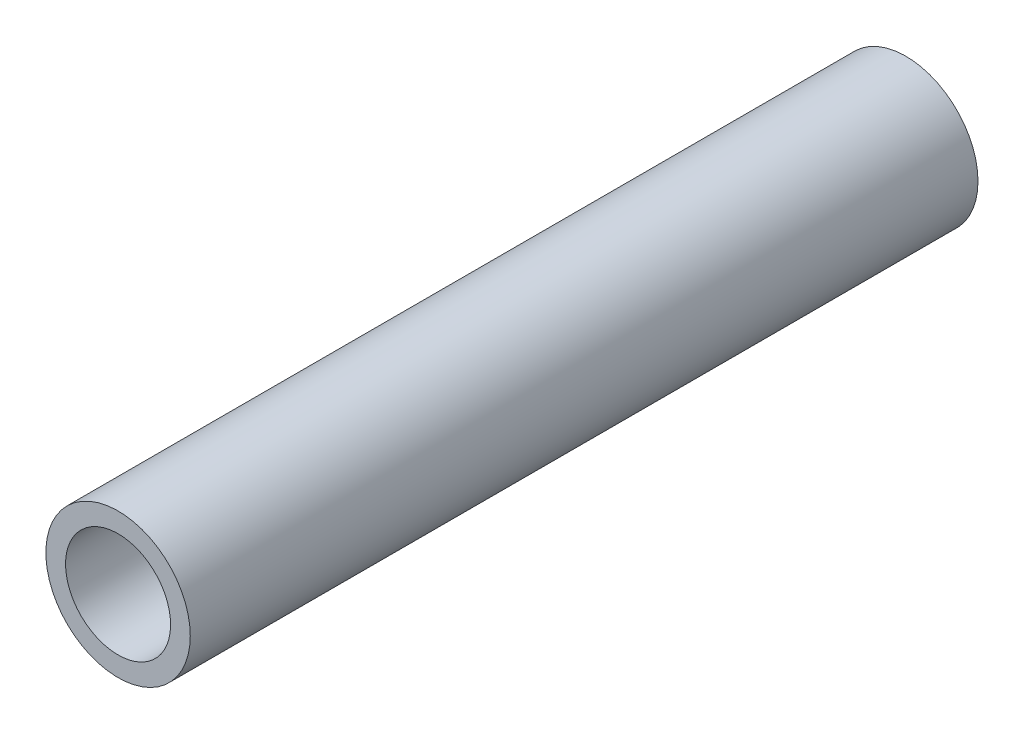
ISO-10303-21;
HEADER;
FILE_DESCRIPTION(('STEP AP214'),'2;1');
FILE_NAME('part.step','',(''),(''),'','','');
FILE_SCHEMA(('AUTOMOTIVE_DESIGN { 1 0 10303 214 1 1 1 1 }'));
ENDSEC;
DATA;
#1=APPLICATION_CONTEXT('core data for automotive mechanical design processes');
#2=APPLICATION_PROTOCOL_DEFINITION('international standard','automotive_design',2000,#1);
#3=PRODUCT_CONTEXT('',#1,'mechanical');
#4=PRODUCT('Part','Part','',(#3));
#5=PRODUCT_RELATED_PRODUCT_CATEGORY('part','',(#4));
#6=PRODUCT_DEFINITION_FORMATION('','',#4);
#7=PRODUCT_DEFINITION_CONTEXT('part definition',#1,'design');
#8=PRODUCT_DEFINITION('design','',#6,#7);
#9=PRODUCT_DEFINITION_SHAPE('','',#8);
#10=(LENGTH_UNIT() NAMED_UNIT(*) SI_UNIT(.MILLI.,.METRE.));
#11=(NAMED_UNIT(*) PLANE_ANGLE_UNIT() SI_UNIT($,.RADIAN.));
#12=(NAMED_UNIT(*) SI_UNIT($,.STERADIAN.) SOLID_ANGLE_UNIT());
#13=UNCERTAINTY_MEASURE_WITH_UNIT(LENGTH_MEASURE(1.E-05),#10,'distance_accuracy_value','');
#14=(GEOMETRIC_REPRESENTATION_CONTEXT(3) GLOBAL_UNCERTAINTY_ASSIGNED_CONTEXT((#13)) GLOBAL_UNIT_ASSIGNED_CONTEXT((#10,
#11,#12)) REPRESENTATION_CONTEXT('',''));
#15=CARTESIAN_POINT('',(0.,0.,0.));
#16=DIRECTION('',(0.,0.,1.));
#17=DIRECTION('',(1.,0.,0.));
#18=AXIS2_PLACEMENT_3D('',#15,#16,#17);
#19=CARTESIAN_POINT('',(0.,0.,60.));
#20=DIRECTION('',(0.,0.,1.));
#21=DIRECTION('',(1.,0.,0.));
#22=AXIS2_PLACEMENT_3D('',#19,#20,#21);
#23=PLANE('',#22);
#24=CARTESIAN_POINT('',(0.,0.,60.));
#25=DIRECTION('',(0.,0.,1.));
#26=DIRECTION('',(1.,0.,0.));
#27=AXIS2_PLACEMENT_3D('',#24,#25,#26);
#28=CIRCLE('',#27,11.);
#29=CARTESIAN_POINT('',(11.,0.,60.));
#30=VERTEX_POINT('',#29);
#31=EDGE_CURVE('E10',#30,#30,#28,.T.);
#32=ORIENTED_EDGE('',*,*,#31,.T.);
#33=EDGE_LOOP('',(#32));
#34=FACE_BOUND('',#33,.T.);
#35=CARTESIAN_POINT('',(0.,0.,60.));
#36=DIRECTION('',(0.,0.,1.));
#37=DIRECTION('',(1.,0.,0.));
#38=AXIS2_PLACEMENT_3D('',#35,#36,#37);
#39=CIRCLE('',#38,8.);
#40=CARTESIAN_POINT('',(8.,0.,60.));
#41=VERTEX_POINT('',#40);
#42=EDGE_CURVE('E48',#41,#41,#39,.T.);
#43=ORIENTED_EDGE('',*,*,#42,.F.);
#44=EDGE_LOOP('',(#43));
#45=FACE_BOUND('',#44,.T.);
#46=ADVANCED_FACE('F40',(#34,#45),#23,.T.);
#47=CARTESIAN_POINT('',(0.,0.,-60.));
#48=DIRECTION('',(0.,0.,1.));
#49=DIRECTION('',(1.,0.,0.));
#50=AXIS2_PLACEMENT_3D('',#47,#48,#49);
#51=PLANE('',#50);
#52=CARTESIAN_POINT('',(0.,0.,-60.));
#53=DIRECTION('',(0.,0.,1.));
#54=DIRECTION('',(1.,0.,0.));
#55=AXIS2_PLACEMENT_3D('',#52,#53,#54);
#56=CIRCLE('',#55,11.);
#57=CARTESIAN_POINT('',(11.,0.,-60.));
#58=VERTEX_POINT('',#57);
#59=EDGE_CURVE('E41',#58,#58,#56,.T.);
#60=ORIENTED_EDGE('',*,*,#59,.F.);
#61=EDGE_LOOP('',(#60));
#62=FACE_BOUND('',#61,.T.);
#63=CARTESIAN_POINT('',(0.,0.,-60.));
#64=DIRECTION('',(0.,0.,1.));
#65=DIRECTION('',(1.,0.,0.));
#66=AXIS2_PLACEMENT_3D('',#63,#64,#65);
#67=CIRCLE('',#66,8.);
#68=CARTESIAN_POINT('',(8.,0.,-60.));
#69=VERTEX_POINT('',#68);
#70=EDGE_CURVE('E49',#69,#69,#67,.T.);
#71=ORIENTED_EDGE('',*,*,#70,.T.);
#72=EDGE_LOOP('',(#71));
#73=FACE_BOUND('',#72,.T.);
#74=ADVANCED_FACE('F58',(#62,#73),#51,.F.);
#75=CARTESIAN_POINT('',(0.,0.,60.));
#76=DIRECTION('',(0.,0.,-1.));
#77=DIRECTION('',(-1.,0.,0.));
#78=AXIS2_PLACEMENT_3D('',#75,#76,#77);
#79=CYLINDRICAL_SURFACE('',#78,11.);
#80=ORIENTED_EDGE('',*,*,#31,.F.);
#81=EDGE_LOOP('',(#80));
#82=FACE_BOUND('',#81,.T.);
#83=ORIENTED_EDGE('',*,*,#59,.T.);
#84=EDGE_LOOP('',(#83));
#85=FACE_BOUND('',#84,.T.);
#86=ADVANCED_FACE('F39',(#82,#85),#79,.T.);
#87=CARTESIAN_POINT('',(0.,0.,60.));
#88=DIRECTION('',(0.,0.,-1.));
#89=DIRECTION('',(-1.,0.,0.));
#90=AXIS2_PLACEMENT_3D('',#87,#88,#89);
#91=CYLINDRICAL_SURFACE('',#90,8.);
#92=ORIENTED_EDGE('',*,*,#42,.T.);
#93=EDGE_LOOP('',(#92));
#94=FACE_BOUND('',#93,.T.);
#95=ORIENTED_EDGE('',*,*,#70,.F.);
#96=EDGE_LOOP('',(#95));
#97=FACE_BOUND('',#96,.T.);
#98=ADVANCED_FACE('F57',(#94,#97),#91,.F.);
#99=CLOSED_SHELL('',(#46,#74,#86,#98));
#100=MANIFOLD_SOLID_BREP('B2',#99);
#101=ADVANCED_BREP_SHAPE_REPRESENTATION('',(#18,#100),#14);
#102=SHAPE_DEFINITION_REPRESENTATION(#9,#101);
ENDSEC;
END-ISO-10303-21;
